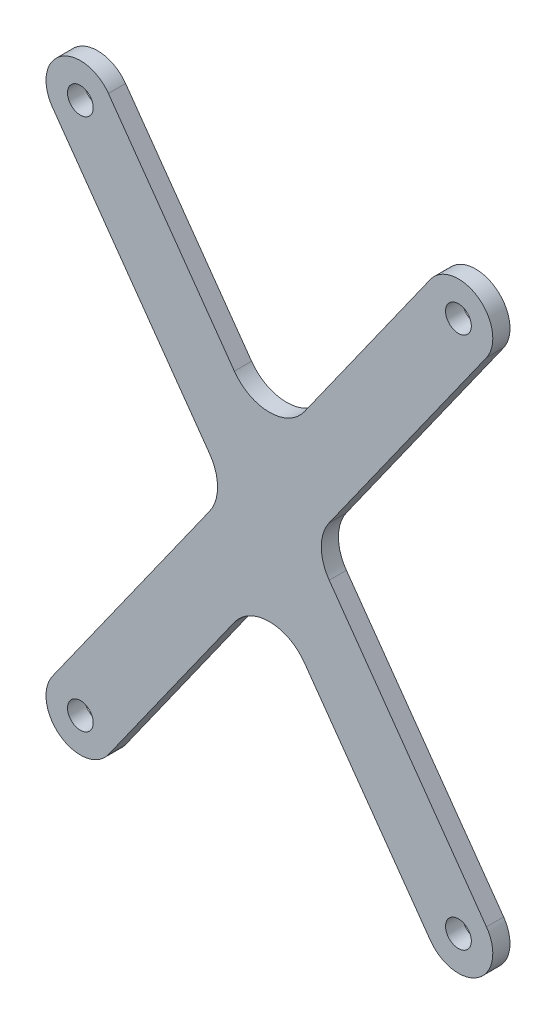
ISO-10303-21;
HEADER;
FILE_DESCRIPTION(('STEP AP214'),'2;1');
FILE_NAME('part.step','',(''),(''),'','','');
FILE_SCHEMA(('AUTOMOTIVE_DESIGN { 1 0 10303 214 1 1 1 1 }'));
ENDSEC;
DATA;
#1=APPLICATION_CONTEXT('core data for automotive mechanical design processes');
#2=APPLICATION_PROTOCOL_DEFINITION('international standard','automotive_design',2000,#1);
#3=PRODUCT_CONTEXT('',#1,'mechanical');
#4=PRODUCT('Part','Part','',(#3));
#5=PRODUCT_RELATED_PRODUCT_CATEGORY('part','',(#4));
#6=PRODUCT_DEFINITION_FORMATION('','',#4);
#7=PRODUCT_DEFINITION_CONTEXT('part definition',#1,'design');
#8=PRODUCT_DEFINITION('design','',#6,#7);
#9=PRODUCT_DEFINITION_SHAPE('','',#8);
#10=(LENGTH_UNIT() NAMED_UNIT(*) SI_UNIT(.MILLI.,.METRE.));
#11=(NAMED_UNIT(*) PLANE_ANGLE_UNIT() SI_UNIT($,.RADIAN.));
#12=(NAMED_UNIT(*) SI_UNIT($,.STERADIAN.) SOLID_ANGLE_UNIT());
#13=UNCERTAINTY_MEASURE_WITH_UNIT(LENGTH_MEASURE(1.E-05),#10,'distance_accuracy_value','');
#14=(GEOMETRIC_REPRESENTATION_CONTEXT(3) GLOBAL_UNCERTAINTY_ASSIGNED_CONTEXT((#13)) GLOBAL_UNIT_ASSIGNED_CONTEXT((#10,
#11,#12)) REPRESENTATION_CONTEXT('',''));
#15=CARTESIAN_POINT('',(0.,0.,0.));
#16=DIRECTION('',(0.,0.,1.));
#17=DIRECTION('',(1.,0.,0.));
#18=AXIS2_PLACEMENT_3D('',#15,#16,#17);
#19=CARTESIAN_POINT('',(1973.78149744196,1133.49748473224,2.));
#20=DIRECTION('',(0.,0.,1.));
#21=DIRECTION('',(1.,0.,0.));
#22=AXIS2_PLACEMENT_3D('',#19,#20,#21);
#23=PLANE('',#22);
#24=CARTESIAN_POINT('',(1973.78149744196,1195.49748473224,2.));
#25=DIRECTION('',(0.,0.,-1.));
#26=DIRECTION('',(-1.,0.,0.));
#27=AXIS2_PLACEMENT_3D('',#24,#25,#26);
#28=CIRCLE('',#27,1.50000000000006);
#29=CARTESIAN_POINT('',(1972.28149744196,1195.49748473224,2.));
#30=VERTEX_POINT('',#29);
#31=EDGE_CURVE('E222',#30,#30,#28,.T.);
#32=ORIENTED_EDGE('',*,*,#31,.T.);
#33=EDGE_LOOP('',(#32));
#34=FACE_BOUND('',#33,.T.);
#35=CARTESIAN_POINT('',(2017.78149744196,1133.49748473224,2.));
#36=DIRECTION('',(0.,0.,-1.));
#37=DIRECTION('',(-1.,0.,0.));
#38=AXIS2_PLACEMENT_3D('',#35,#36,#37);
#39=CIRCLE('',#38,1.50000000000006);
#40=CARTESIAN_POINT('',(2016.28149744196,1133.49748473224,2.));
#41=VERTEX_POINT('',#40);
#42=EDGE_CURVE('E228',#41,#41,#39,.T.);
#43=ORIENTED_EDGE('',*,*,#42,.T.);
#44=EDGE_LOOP('',(#43));
#45=FACE_BOUND('',#44,.T.);
#46=CARTESIAN_POINT('',(1984.74542000462,1164.49748473224,2.));
#47=DIRECTION('',(0.,0.,-1.));
#48=DIRECTION('',(-1.,0.,0.));
#49=AXIS2_PLACEMENT_3D('',#46,#47,#48);
#50=CIRCLE('',#49,5.00000000000012);
#51=CARTESIAN_POINT('',(1988.8229557283,1167.39121976194,2.));
#52=VERTEX_POINT('',#51);
#53=CARTESIAN_POINT('',(1988.8229557283,1161.60374970253,2.));
#54=VERTEX_POINT('',#53);
#55=EDGE_CURVE('E236',#52,#54,#50,.T.);
#56=ORIENTED_EDGE('',*,*,#55,.T.);
#57=DIRECTION('',(0.578747005941122,0.815507144735217,0.));
#58=VECTOR('',#57,1.);
#59=CARTESIAN_POINT('',(1970.51946886302,1135.812472756,2.));
#60=LINE('',#59,#58);
#61=CARTESIAN_POINT('',(1970.51946886302,1135.812472756,2.));
#62=VERTEX_POINT('',#61);
#63=EDGE_CURVE('E159',#54,#62,#60,.F.);
#64=ORIENTED_EDGE('',*,*,#63,.T.);
#65=CARTESIAN_POINT('',(1973.78149744196,1133.49748473224,2.));
#66=DIRECTION('',(0.,0.,-1.));
#67=DIRECTION('',(-1.,0.,0.));
#68=AXIS2_PLACEMENT_3D('',#65,#66,#67);
#69=CIRCLE('',#68,4.);
#70=CARTESIAN_POINT('',(1977.0435260209,1131.18249670847,2.));
#71=VERTEX_POINT('',#70);
#72=EDGE_CURVE('E162',#71,#62,#69,.T.);
#73=ORIENTED_EDGE('',*,*,#72,.F.);
#74=DIRECTION('',(-0.578747005941122,-0.815507144735217,0.));
#75=VECTOR('',#74,1.);
#76=CARTESIAN_POINT('',(1991.70396171829,1151.84038337297,2.));
#77=LINE('',#76,#75);
#78=CARTESIAN_POINT('',(1991.70396171829,1151.84038337297,2.));
#79=VERTEX_POINT('',#78);
#80=EDGE_CURVE('E134',#71,#79,#77,.F.);
#81=ORIENTED_EDGE('',*,*,#80,.T.);
#82=CARTESIAN_POINT('',(1995.78149744196,1148.94664834326,2.));
#83=DIRECTION('',(0.,0.,-1.));
#84=DIRECTION('',(-1.,0.,0.));
#85=AXIS2_PLACEMENT_3D('',#82,#83,#84);
#86=CIRCLE('',#85,5.00000000000012);
#87=CARTESIAN_POINT('',(1999.85903316564,1151.84038337297,2.));
#88=VERTEX_POINT('',#87);
#89=EDGE_CURVE('E20',#79,#88,#86,.T.);
#90=ORIENTED_EDGE('',*,*,#89,.T.);
#91=DIRECTION('',(-0.578747005941094,0.815507144735237,0.));
#92=VECTOR('',#91,1.);
#93=CARTESIAN_POINT('',(1999.85903316564,1151.84038337297,2.));
#94=LINE('',#93,#92);
#95=CARTESIAN_POINT('',(2014.51946886302,1131.18249670847,2.));
#96=VERTEX_POINT('',#95);
#97=EDGE_CURVE('E130',#88,#96,#94,.F.);
#98=ORIENTED_EDGE('',*,*,#97,.T.);
#99=CARTESIAN_POINT('',(2017.78149744196,1133.49748473224,2.));
#100=DIRECTION('',(0.,0.,-1.));
#101=DIRECTION('',(-1.,0.,0.));
#102=AXIS2_PLACEMENT_3D('',#99,#100,#101);
#103=CIRCLE('',#102,4.00000000000089);
#104=CARTESIAN_POINT('',(2021.0435260209,1135.812472756,2.));
#105=VERTEX_POINT('',#104);
#106=EDGE_CURVE('E145',#105,#96,#103,.T.);
#107=ORIENTED_EDGE('',*,*,#106,.F.);
#108=DIRECTION('',(0.57874700594113,-0.815507144735212,0.));
#109=VECTOR('',#108,1.);
#110=CARTESIAN_POINT('',(2021.0435260209,1135.812472756,2.));
#111=LINE('',#110,#109);
#112=CARTESIAN_POINT('',(2002.74003915562,1161.60374970253,2.));
#113=VERTEX_POINT('',#112);
#114=EDGE_CURVE('E182',#105,#113,#111,.F.);
#115=ORIENTED_EDGE('',*,*,#114,.T.);
#116=CARTESIAN_POINT('',(2006.8175748793,1164.49748473224,2.));
#117=DIRECTION('',(0.,0.,-1.));
#118=DIRECTION('',(-1.,0.,0.));
#119=AXIS2_PLACEMENT_3D('',#116,#117,#118);
#120=CIRCLE('',#119,5.00000000000034);
#121=CARTESIAN_POINT('',(2002.74003915562,1167.39121976194,2.));
#122=VERTEX_POINT('',#121);
#123=EDGE_CURVE('E244',#113,#122,#120,.T.);
#124=ORIENTED_EDGE('',*,*,#123,.T.);
#125=DIRECTION('',(-0.578747005941127,-0.815507144735214,0.));
#126=VECTOR('',#125,1.);
#127=CARTESIAN_POINT('',(2021.0435260209,1193.18249670847,2.));
#128=LINE('',#127,#126);
#129=CARTESIAN_POINT('',(2021.0435260209,1193.18249670847,2.));
#130=VERTEX_POINT('',#129);
#131=EDGE_CURVE('E177',#122,#130,#128,.F.);
#132=ORIENTED_EDGE('',*,*,#131,.T.);
#133=CARTESIAN_POINT('',(2017.78149744196,1195.49748473224,2.));
#134=DIRECTION('',(0.,0.,-1.));
#135=DIRECTION('',(-1.,0.,0.));
#136=AXIS2_PLACEMENT_3D('',#133,#134,#135);
#137=CIRCLE('',#136,4.);
#138=CARTESIAN_POINT('',(2014.51946886302,1197.812472756,2.));
#139=VERTEX_POINT('',#138);
#140=EDGE_CURVE('E180',#139,#130,#137,.T.);
#141=ORIENTED_EDGE('',*,*,#140,.F.);
#142=DIRECTION('',(0.578747005941113,0.815507144735224,0.));
#143=VECTOR('',#142,1.);
#144=CARTESIAN_POINT('',(1999.85903316564,1177.15458609151,2.));
#145=LINE('',#144,#143);
#146=CARTESIAN_POINT('',(1999.85903316564,1177.15458609151,2.));
#147=VERTEX_POINT('',#146);
#148=EDGE_CURVE('E173',#139,#147,#145,.F.);
#149=ORIENTED_EDGE('',*,*,#148,.T.);
#150=CARTESIAN_POINT('',(1995.78149744196,1180.04832112121,2.));
#151=DIRECTION('',(0.,0.,-1.));
#152=DIRECTION('',(-1.,0.,0.));
#153=AXIS2_PLACEMENT_3D('',#150,#151,#152);
#154=CIRCLE('',#153,5.00000000000012);
#155=CARTESIAN_POINT('',(1991.70396171829,1177.15458609151,2.));
#156=VERTEX_POINT('',#155);
#157=EDGE_CURVE('E240',#147,#156,#154,.T.);
#158=ORIENTED_EDGE('',*,*,#157,.T.);
#159=DIRECTION('',(0.578747005941113,-0.815507144735224,0.));
#160=VECTOR('',#159,1.);
#161=CARTESIAN_POINT('',(1991.70396171829,1177.15458609151,2.));
#162=LINE('',#161,#160);
#163=CARTESIAN_POINT('',(1977.0435260209,1197.812472756,2.));
#164=VERTEX_POINT('',#163);
#165=EDGE_CURVE('E168',#156,#164,#162,.F.);
#166=ORIENTED_EDGE('',*,*,#165,.T.);
#167=CARTESIAN_POINT('',(1973.78149744196,1195.49748473224,2.));
#168=DIRECTION('',(0.,0.,-1.));
#169=DIRECTION('',(-1.,0.,0.));
#170=AXIS2_PLACEMENT_3D('',#167,#168,#169);
#171=CIRCLE('',#170,3.99999999999978);
#172=CARTESIAN_POINT('',(1970.51946886302,1193.18249670847,2.));
#173=VERTEX_POINT('',#172);
#174=EDGE_CURVE('E238',#173,#164,#171,.T.);
#175=ORIENTED_EDGE('',*,*,#174,.F.);
#176=DIRECTION('',(-0.578747005941103,0.815507144735231,0.));
#177=VECTOR('',#176,1.);
#178=CARTESIAN_POINT('',(1970.51946886302,1193.18249670847,2.));
#179=LINE('',#178,#177);
#180=EDGE_CURVE('E164',#173,#52,#179,.F.);
#181=ORIENTED_EDGE('',*,*,#180,.T.);
#182=EDGE_LOOP('',(#56,#64,#73,#81,#90,#98,#107,#115,#124,#132,#141,#149,#158,#166,#175,#181));
#183=FACE_BOUND('',#182,.T.);
#184=CARTESIAN_POINT('',(1973.78149744196,1133.49748473224,2.));
#185=DIRECTION('',(0.,0.,-1.));
#186=DIRECTION('',(-1.,0.,0.));
#187=AXIS2_PLACEMENT_3D('',#184,#185,#186);
#188=CIRCLE('',#187,1.50000000000006);
#189=CARTESIAN_POINT('',(1972.28149744196,1133.49748473224,2.));
#190=VERTEX_POINT('',#189);
#191=EDGE_CURVE('E231',#190,#190,#188,.T.);
#192=ORIENTED_EDGE('',*,*,#191,.T.);
#193=EDGE_LOOP('',(#192));
#194=FACE_BOUND('',#193,.T.);
#195=CARTESIAN_POINT('',(2017.78149744196,1195.49748473224,2.));
#196=DIRECTION('',(0.,0.,-1.));
#197=DIRECTION('',(-1.,0.,0.));
#198=AXIS2_PLACEMENT_3D('',#195,#196,#197);
#199=CIRCLE('',#198,1.50000000000006);
#200=CARTESIAN_POINT('',(2016.28149744196,1195.49748473224,2.));
#201=VERTEX_POINT('',#200);
#202=EDGE_CURVE('E225',#201,#201,#199,.T.);
#203=ORIENTED_EDGE('',*,*,#202,.T.);
#204=EDGE_LOOP('',(#203));
#205=FACE_BOUND('',#204,.T.);
#206=ADVANCED_FACE('F17',(#34,#45,#183,#194,#205),#23,.T.);
#207=CARTESIAN_POINT('',(1991.70396171829,1151.84038337297,2.));
#208=DIRECTION('',(-0.815507144735217,0.578747005941122,0.));
#209=DIRECTION('',(-0.578747005941122,-0.815507144735217,0.));
#210=AXIS2_PLACEMENT_3D('',#207,#208,#209);
#211=PLANE('',#210);
#212=DIRECTION('',(0.,0.,-1.));
#213=VECTOR('',#212,1.);
#214=CARTESIAN_POINT('',(1991.70396171829,1151.84038337297,2.));
#215=LINE('',#214,#213);
#216=CARTESIAN_POINT('',(1991.70396171829,1151.84038337297,0.));
#217=VERTEX_POINT('',#216);
#218=EDGE_CURVE('E139',#217,#79,#215,.F.);
#219=ORIENTED_EDGE('',*,*,#218,.T.);
#220=ORIENTED_EDGE('',*,*,#80,.F.);
#221=DIRECTION('',(0.,0.,1.));
#222=VECTOR('',#221,1.);
#223=CARTESIAN_POINT('',(1977.0435260209,1131.18249670847,2.));
#224=LINE('',#223,#222);
#225=CARTESIAN_POINT('',(1977.0435260209,1131.18249670847,0.));
#226=VERTEX_POINT('',#225);
#227=EDGE_CURVE('E156',#226,#71,#224,.T.);
#228=ORIENTED_EDGE('',*,*,#227,.F.);
#229=DIRECTION('',(0.578747005941122,0.815507144735217,0.));
#230=VECTOR('',#229,1.);
#231=CARTESIAN_POINT('',(1977.0435260209,1131.18249670847,0.));
#232=LINE('',#231,#230);
#233=EDGE_CURVE('E220',#226,#217,#232,.T.);
#234=ORIENTED_EDGE('',*,*,#233,.T.);
#235=EDGE_LOOP('',(#219,#220,#228,#234));
#236=FACE_BOUND('',#235,.T.);
#237=ADVANCED_FACE('F499',(#236),#211,.F.);
#238=CARTESIAN_POINT('',(1995.78149744196,1148.94664834326,2.));
#239=DIRECTION('',(0.,0.,-1.));
#240=DIRECTION('',(-1.,0.,0.));
#241=AXIS2_PLACEMENT_3D('',#238,#239,#240);
#242=CYLINDRICAL_SURFACE('',#241,5.00000000000012);
#243=DIRECTION('',(0.,0.,1.));
#244=VECTOR('',#243,1.);
#245=CARTESIAN_POINT('',(1999.85903316564,1151.84038337297,2.));
#246=LINE('',#245,#244);
#247=CARTESIAN_POINT('',(1999.85903316564,1151.84038337297,0.));
#248=VERTEX_POINT('',#247);
#249=EDGE_CURVE('E138',#248,#88,#246,.T.);
#250=ORIENTED_EDGE('',*,*,#249,.T.);
#251=ORIENTED_EDGE('',*,*,#89,.F.);
#252=ORIENTED_EDGE('',*,*,#218,.F.);
#253=CARTESIAN_POINT('',(1995.78149744196,1148.94664834326,0.));
#254=DIRECTION('',(0.,0.,-1.));
#255=DIRECTION('',(-1.,0.,0.));
#256=AXIS2_PLACEMENT_3D('',#253,#254,#255);
#257=CIRCLE('',#256,5.00000000000012);
#258=EDGE_CURVE('E150',#217,#248,#257,.T.);
#259=ORIENTED_EDGE('',*,*,#258,.T.);
#260=EDGE_LOOP('',(#250,#251,#252,#259));
#261=FACE_BOUND('',#260,.T.);
#262=ADVANCED_FACE('F148',(#261),#242,.F.);
#263=CARTESIAN_POINT('',(1999.85903316564,1151.84038337297,2.));
#264=DIRECTION('',(0.815507144735237,0.578747005941094,0.));
#265=DIRECTION('',(-0.578747005941094,0.815507144735237,0.));
#266=AXIS2_PLACEMENT_3D('',#263,#264,#265);
#267=PLANE('',#266);
#268=DIRECTION('',(0.,0.,-1.));
#269=VECTOR('',#268,1.);
#270=CARTESIAN_POINT('',(2014.51946886302,1131.18249670847,2.));
#271=LINE('',#270,#269);
#272=CARTESIAN_POINT('',(2014.51946886302,1131.18249670847,0.));
#273=VERTEX_POINT('',#272);
#274=EDGE_CURVE('E144',#96,#273,#271,.T.);
#275=ORIENTED_EDGE('',*,*,#274,.F.);
#276=ORIENTED_EDGE('',*,*,#97,.F.);
#277=ORIENTED_EDGE('',*,*,#249,.F.);
#278=DIRECTION('',(0.578747005941126,-0.815507144735215,0.));
#279=VECTOR('',#278,1.);
#280=CARTESIAN_POINT('',(1999.85903316564,1151.84038337297,0.));
#281=LINE('',#280,#279);
#282=EDGE_CURVE('E218',#248,#273,#281,.T.);
#283=ORIENTED_EDGE('',*,*,#282,.T.);
#284=EDGE_LOOP('',(#275,#276,#277,#283));
#285=FACE_BOUND('',#284,.T.);
#286=ADVANCED_FACE('F141',(#285),#267,.F.);
#287=CARTESIAN_POINT('',(2017.78149744196,1133.49748473224,2.));
#288=DIRECTION('',(0.,0.,-1.));
#289=DIRECTION('',(-1.,0.,0.));
#290=AXIS2_PLACEMENT_3D('',#287,#288,#289);
#291=CYLINDRICAL_SURFACE('',#290,4.00000000000089);
#292=ORIENTED_EDGE('',*,*,#106,.T.);
#293=ORIENTED_EDGE('',*,*,#274,.T.);
#294=CARTESIAN_POINT('',(2017.78149744196,1133.49748473224,0.));
#295=DIRECTION('',(0.,0.,-1.));
#296=DIRECTION('',(-1.,0.,0.));
#297=AXIS2_PLACEMENT_3D('',#294,#295,#296);
#298=CIRCLE('',#297,4.00000000000089);
#299=CARTESIAN_POINT('',(2021.0435260209,1135.812472756,0.));
#300=VERTEX_POINT('',#299);
#301=EDGE_CURVE('E215',#273,#300,#298,.F.);
#302=ORIENTED_EDGE('',*,*,#301,.T.);
#303=DIRECTION('',(0.,0.,1.));
#304=VECTOR('',#303,1.);
#305=CARTESIAN_POINT('',(2021.0435260209,1135.812472756,2.));
#306=LINE('',#305,#304);
#307=EDGE_CURVE('E185',#300,#105,#306,.T.);
#308=ORIENTED_EDGE('',*,*,#307,.T.);
#309=EDGE_LOOP('',(#292,#293,#302,#308));
#310=FACE_BOUND('',#309,.T.);
#311=ADVANCED_FACE('F477',(#310),#291,.T.);
#312=CARTESIAN_POINT('',(2021.0435260209,1135.812472756,2.));
#313=DIRECTION('',(-0.815507144735212,-0.57874700594113,0.));
#314=DIRECTION('',(0.57874700594113,-0.815507144735212,0.));
#315=AXIS2_PLACEMENT_3D('',#312,#313,#314);
#316=PLANE('',#315);
#317=DIRECTION('',(0.,0.,-1.));
#318=VECTOR('',#317,1.);
#319=CARTESIAN_POINT('',(2002.74003915562,1161.60374970253,2.));
#320=LINE('',#319,#318);
#321=CARTESIAN_POINT('',(2002.74003915562,1161.60374970253,0.));
#322=VERTEX_POINT('',#321);
#323=EDGE_CURVE('E184',#322,#113,#320,.F.);
#324=ORIENTED_EDGE('',*,*,#323,.T.);
#325=ORIENTED_EDGE('',*,*,#114,.F.);
#326=ORIENTED_EDGE('',*,*,#307,.F.);
#327=DIRECTION('',(-0.57874700594113,0.815507144735212,0.));
#328=VECTOR('',#327,1.);
#329=CARTESIAN_POINT('',(2021.0435260209,1135.812472756,0.));
#330=LINE('',#329,#328);
#331=EDGE_CURVE('E214',#300,#322,#330,.T.);
#332=ORIENTED_EDGE('',*,*,#331,.T.);
#333=EDGE_LOOP('',(#324,#325,#326,#332));
#334=FACE_BOUND('',#333,.T.);
#335=ADVANCED_FACE('F325',(#334),#316,.F.);
#336=CARTESIAN_POINT('',(2006.8175748793,1164.49748473224,2.));
#337=DIRECTION('',(0.,0.,-1.));
#338=DIRECTION('',(-1.,0.,0.));
#339=AXIS2_PLACEMENT_3D('',#336,#337,#338);
#340=CYLINDRICAL_SURFACE('',#339,5.00000000000034);
#341=ORIENTED_EDGE('',*,*,#123,.F.);
#342=ORIENTED_EDGE('',*,*,#323,.F.);
#343=CARTESIAN_POINT('',(2006.8175748793,1164.49748473224,0.));
#344=DIRECTION('',(0.,0.,-1.));
#345=DIRECTION('',(-1.,0.,0.));
#346=AXIS2_PLACEMENT_3D('',#343,#344,#345);
#347=CIRCLE('',#346,5.00000000000034);
#348=CARTESIAN_POINT('',(2002.74003915562,1167.39121976194,0.));
#349=VERTEX_POINT('',#348);
#350=EDGE_CURVE('E212',#322,#349,#347,.T.);
#351=ORIENTED_EDGE('',*,*,#350,.T.);
#352=DIRECTION('',(0.,0.,1.));
#353=VECTOR('',#352,1.);
#354=CARTESIAN_POINT('',(2002.74003915562,1167.39121976194,2.));
#355=LINE('',#354,#353);
#356=EDGE_CURVE('E181',#349,#122,#355,.T.);
#357=ORIENTED_EDGE('',*,*,#356,.T.);
#358=EDGE_LOOP('',(#341,#342,#351,#357));
#359=FACE_BOUND('',#358,.T.);
#360=ADVANCED_FACE('F322',(#359),#340,.F.);
#361=CARTESIAN_POINT('',(2021.0435260209,1193.18249670847,2.));
#362=DIRECTION('',(-0.815507144735214,0.578747005941127,0.));
#363=DIRECTION('',(-0.578747005941127,-0.815507144735214,0.));
#364=AXIS2_PLACEMENT_3D('',#361,#362,#363);
#365=PLANE('',#364);
#366=DIRECTION('',(0.,0.,-1.));
#367=VECTOR('',#366,1.);
#368=CARTESIAN_POINT('',(2021.0435260209,1193.18249670847,2.));
#369=LINE('',#368,#367);
#370=CARTESIAN_POINT('',(2021.0435260209,1193.18249670847,0.));
#371=VERTEX_POINT('',#370);
#372=EDGE_CURVE('E243',#130,#371,#369,.T.);
#373=ORIENTED_EDGE('',*,*,#372,.F.);
#374=ORIENTED_EDGE('',*,*,#131,.F.);
#375=ORIENTED_EDGE('',*,*,#356,.F.);
#376=DIRECTION('',(0.578747005941127,0.815507144735214,0.));
#377=VECTOR('',#376,1.);
#378=CARTESIAN_POINT('',(2002.74003915562,1167.39121976194,0.));
#379=LINE('',#378,#377);
#380=EDGE_CURVE('E211',#349,#371,#379,.T.);
#381=ORIENTED_EDGE('',*,*,#380,.T.);
#382=EDGE_LOOP('',(#373,#374,#375,#381));
#383=FACE_BOUND('',#382,.T.);
#384=ADVANCED_FACE('F319',(#383),#365,.F.);
#385=CARTESIAN_POINT('',(2017.78149744196,1195.49748473224,2.));
#386=DIRECTION('',(0.,0.,-1.));
#387=DIRECTION('',(-1.,0.,0.));
#388=AXIS2_PLACEMENT_3D('',#385,#386,#387);
#389=CYLINDRICAL_SURFACE('',#388,4.);
#390=ORIENTED_EDGE('',*,*,#140,.T.);
#391=ORIENTED_EDGE('',*,*,#372,.T.);
#392=CARTESIAN_POINT('',(2017.78149744196,1195.49748473224,0.));
#393=DIRECTION('',(0.,0.,-1.));
#394=DIRECTION('',(-1.,0.,0.));
#395=AXIS2_PLACEMENT_3D('',#392,#393,#394);
#396=CIRCLE('',#395,4.);
#397=CARTESIAN_POINT('',(2014.51946886302,1197.812472756,0.));
#398=VERTEX_POINT('',#397);
#399=EDGE_CURVE('E208',#371,#398,#396,.F.);
#400=ORIENTED_EDGE('',*,*,#399,.T.);
#401=DIRECTION('',(0.,0.,1.));
#402=VECTOR('',#401,1.);
#403=CARTESIAN_POINT('',(2014.51946886302,1197.812472756,2.));
#404=LINE('',#403,#402);
#405=EDGE_CURVE('E176',#398,#139,#404,.T.);
#406=ORIENTED_EDGE('',*,*,#405,.T.);
#407=EDGE_LOOP('',(#390,#391,#400,#406));
#408=FACE_BOUND('',#407,.T.);
#409=ADVANCED_FACE('F313',(#408),#389,.T.);
#410=CARTESIAN_POINT('',(1999.85903316564,1177.15458609151,2.));
#411=DIRECTION('',(0.815507144735224,-0.578747005941113,0.));
#412=DIRECTION('',(0.578747005941113,0.815507144735224,0.));
#413=AXIS2_PLACEMENT_3D('',#410,#411,#412);
#414=PLANE('',#413);
#415=DIRECTION('',(0.,0.,-1.));
#416=VECTOR('',#415,1.);
#417=CARTESIAN_POINT('',(1999.85903316564,1177.15458609151,2.));
#418=LINE('',#417,#416);
#419=CARTESIAN_POINT('',(1999.85903316564,1177.15458609151,0.));
#420=VERTEX_POINT('',#419);
#421=EDGE_CURVE('E175',#420,#147,#418,.F.);
#422=ORIENTED_EDGE('',*,*,#421,.T.);
#423=ORIENTED_EDGE('',*,*,#148,.F.);
#424=ORIENTED_EDGE('',*,*,#405,.F.);
#425=DIRECTION('',(-0.578747005941109,-0.815507144735227,0.));
#426=VECTOR('',#425,1.);
#427=CARTESIAN_POINT('',(2014.51946886302,1197.812472756,0.));
#428=LINE('',#427,#426);
#429=EDGE_CURVE('E207',#398,#420,#428,.T.);
#430=ORIENTED_EDGE('',*,*,#429,.T.);
#431=EDGE_LOOP('',(#422,#423,#424,#430));
#432=FACE_BOUND('',#431,.T.);
#433=ADVANCED_FACE('F310',(#432),#414,.F.);
#434=CARTESIAN_POINT('',(1995.78149744196,1180.04832112121,2.));
#435=DIRECTION('',(0.,0.,-1.));
#436=DIRECTION('',(-1.,0.,0.));
#437=AXIS2_PLACEMENT_3D('',#434,#435,#436);
#438=CYLINDRICAL_SURFACE('',#437,5.00000000000012);
#439=DIRECTION('',(0.,0.,1.));
#440=VECTOR('',#439,1.);
#441=CARTESIAN_POINT('',(1991.70396171829,1177.15458609151,2.));
#442=LINE('',#441,#440);
#443=CARTESIAN_POINT('',(1991.70396171829,1177.15458609151,0.));
#444=VERTEX_POINT('',#443);
#445=EDGE_CURVE('E172',#444,#156,#442,.T.);
#446=ORIENTED_EDGE('',*,*,#445,.T.);
#447=ORIENTED_EDGE('',*,*,#157,.F.);
#448=ORIENTED_EDGE('',*,*,#421,.F.);
#449=CARTESIAN_POINT('',(1995.78149744196,1180.04832112121,0.));
#450=DIRECTION('',(0.,0.,-1.));
#451=DIRECTION('',(-1.,0.,0.));
#452=AXIS2_PLACEMENT_3D('',#449,#450,#451);
#453=CIRCLE('',#452,5.00000000000012);
#454=EDGE_CURVE('E204',#420,#444,#453,.T.);
#455=ORIENTED_EDGE('',*,*,#454,.T.);
#456=EDGE_LOOP('',(#446,#447,#448,#455));
#457=FACE_BOUND('',#456,.T.);
#458=ADVANCED_FACE('F306',(#457),#438,.F.);
#459=CARTESIAN_POINT('',(1991.70396171829,1177.15458609151,2.));
#460=DIRECTION('',(-0.815507144735224,-0.578747005941113,0.));
#461=DIRECTION('',(0.578747005941113,-0.815507144735224,0.));
#462=AXIS2_PLACEMENT_3D('',#459,#460,#461);
#463=PLANE('',#462);
#464=DIRECTION('',(0.,0.,-1.));
#465=VECTOR('',#464,1.);
#466=CARTESIAN_POINT('',(1977.0435260209,1197.812472756,2.));
#467=LINE('',#466,#465);
#468=CARTESIAN_POINT('',(1977.0435260209,1197.812472756,0.));
#469=VERTEX_POINT('',#468);
#470=EDGE_CURVE('E171',#164,#469,#467,.T.);
#471=ORIENTED_EDGE('',*,*,#470,.F.);
#472=ORIENTED_EDGE('',*,*,#165,.F.);
#473=ORIENTED_EDGE('',*,*,#445,.F.);
#474=DIRECTION('',(-0.578747005941115,0.815507144735222,0.));
#475=VECTOR('',#474,1.);
#476=CARTESIAN_POINT('',(1991.70396171829,1177.15458609151,0.));
#477=LINE('',#476,#475);
#478=EDGE_CURVE('E203',#444,#469,#477,.T.);
#479=ORIENTED_EDGE('',*,*,#478,.T.);
#480=EDGE_LOOP('',(#471,#472,#473,#479));
#481=FACE_BOUND('',#480,.T.);
#482=ADVANCED_FACE('F302',(#481),#463,.F.);
#483=CARTESIAN_POINT('',(1973.78149744196,1195.49748473224,2.));
#484=DIRECTION('',(0.,0.,-1.));
#485=DIRECTION('',(-1.,0.,0.));
#486=AXIS2_PLACEMENT_3D('',#483,#484,#485);
#487=CYLINDRICAL_SURFACE('',#486,3.99999999999978);
#488=CARTESIAN_POINT('',(1973.78149744196,1195.49748473224,0.));
#489=DIRECTION('',(0.,0.,-1.));
#490=DIRECTION('',(-1.,0.,0.));
#491=AXIS2_PLACEMENT_3D('',#488,#489,#490);
#492=CIRCLE('',#491,3.99999999999978);
#493=CARTESIAN_POINT('',(1970.51946886302,1193.18249670847,0.));
#494=VERTEX_POINT('',#493);
#495=EDGE_CURVE('E201',#469,#494,#492,.F.);
#496=ORIENTED_EDGE('',*,*,#495,.T.);
#497=DIRECTION('',(0.,0.,1.));
#498=VECTOR('',#497,1.);
#499=CARTESIAN_POINT('',(1970.51946886302,1193.18249670847,2.));
#500=LINE('',#499,#498);
#501=EDGE_CURVE('E167',#494,#173,#500,.T.);
#502=ORIENTED_EDGE('',*,*,#501,.T.);
#503=ORIENTED_EDGE('',*,*,#174,.T.);
#504=ORIENTED_EDGE('',*,*,#470,.T.);
#505=EDGE_LOOP('',(#496,#502,#503,#504));
#506=FACE_BOUND('',#505,.T.);
#507=ADVANCED_FACE('F327',(#506),#487,.T.);
#508=CARTESIAN_POINT('',(1970.51946886302,1193.18249670847,2.));
#509=DIRECTION('',(0.815507144735231,0.578747005941103,0.));
#510=DIRECTION('',(-0.578747005941103,0.815507144735231,0.));
#511=AXIS2_PLACEMENT_3D('',#508,#509,#510);
#512=PLANE('',#511);
#513=DIRECTION('',(0.,0.,-1.));
#514=VECTOR('',#513,1.);
#515=CARTESIAN_POINT('',(1988.8229557283,1167.39121976194,2.));
#516=LINE('',#515,#514);
#517=CARTESIAN_POINT('',(1988.8229557283,1167.39121976194,0.));
#518=VERTEX_POINT('',#517);
#519=EDGE_CURVE('E166',#518,#52,#516,.F.);
#520=ORIENTED_EDGE('',*,*,#519,.T.);
#521=ORIENTED_EDGE('',*,*,#180,.F.);
#522=ORIENTED_EDGE('',*,*,#501,.F.);
#523=DIRECTION('',(0.578747005941098,-0.815507144735235,0.));
#524=VECTOR('',#523,1.);
#525=CARTESIAN_POINT('',(1970.51946886302,1193.18249670847,0.));
#526=LINE('',#525,#524);
#527=EDGE_CURVE('E200',#494,#518,#526,.T.);
#528=ORIENTED_EDGE('',*,*,#527,.T.);
#529=EDGE_LOOP('',(#520,#521,#522,#528));
#530=FACE_BOUND('',#529,.T.);
#531=ADVANCED_FACE('F294',(#530),#512,.F.);
#532=CARTESIAN_POINT('',(1984.74542000462,1164.49748473224,2.));
#533=DIRECTION('',(0.,0.,-1.));
#534=DIRECTION('',(-1.,0.,0.));
#535=AXIS2_PLACEMENT_3D('',#532,#533,#534);
#536=CYLINDRICAL_SURFACE('',#535,5.00000000000012);
#537=DIRECTION('',(0.,0.,1.));
#538=VECTOR('',#537,1.);
#539=CARTESIAN_POINT('',(1988.8229557283,1161.60374970253,2.));
#540=LINE('',#539,#538);
#541=CARTESIAN_POINT('',(1988.8229557283,1161.60374970253,0.));
#542=VERTEX_POINT('',#541);
#543=EDGE_CURVE('E163',#542,#54,#540,.T.);
#544=ORIENTED_EDGE('',*,*,#543,.T.);
#545=ORIENTED_EDGE('',*,*,#55,.F.);
#546=ORIENTED_EDGE('',*,*,#519,.F.);
#547=CARTESIAN_POINT('',(1984.74542000462,1164.49748473224,0.));
#548=DIRECTION('',(0.,0.,-1.));
#549=DIRECTION('',(-1.,0.,0.));
#550=AXIS2_PLACEMENT_3D('',#547,#548,#549);
#551=CIRCLE('',#550,5.00000000000012);
#552=EDGE_CURVE('E197',#518,#542,#551,.T.);
#553=ORIENTED_EDGE('',*,*,#552,.T.);
#554=EDGE_LOOP('',(#544,#545,#546,#553));
#555=FACE_BOUND('',#554,.T.);
#556=ADVANCED_FACE('F290',(#555),#536,.F.);
#557=CARTESIAN_POINT('',(1970.51946886302,1135.812472756,2.));
#558=DIRECTION('',(0.815507144735217,-0.578747005941122,0.));
#559=DIRECTION('',(0.578747005941122,0.815507144735217,0.));
#560=AXIS2_PLACEMENT_3D('',#557,#558,#559);
#561=PLANE('',#560);
#562=DIRECTION('',(0.,0.,-1.));
#563=VECTOR('',#562,1.);
#564=CARTESIAN_POINT('',(1970.51946886302,1135.812472756,2.));
#565=LINE('',#564,#563);
#566=CARTESIAN_POINT('',(1970.51946886302,1135.812472756,0.));
#567=VERTEX_POINT('',#566);
#568=EDGE_CURVE('E234',#62,#567,#565,.T.);
#569=ORIENTED_EDGE('',*,*,#568,.F.);
#570=ORIENTED_EDGE('',*,*,#63,.F.);
#571=ORIENTED_EDGE('',*,*,#543,.F.);
#572=DIRECTION('',(-0.578747005941118,-0.81550714473522,0.));
#573=VECTOR('',#572,1.);
#574=CARTESIAN_POINT('',(1988.8229557283,1161.60374970253,0.));
#575=LINE('',#574,#573);
#576=EDGE_CURVE('E196',#542,#567,#575,.T.);
#577=ORIENTED_EDGE('',*,*,#576,.T.);
#578=EDGE_LOOP('',(#569,#570,#571,#577));
#579=FACE_BOUND('',#578,.T.);
#580=ADVANCED_FACE('F284',(#579),#561,.F.);
#581=CARTESIAN_POINT('',(1973.78149744196,1133.49748473224,2.));
#582=DIRECTION('',(0.,0.,-1.));
#583=DIRECTION('',(-1.,0.,0.));
#584=AXIS2_PLACEMENT_3D('',#581,#582,#583);
#585=CYLINDRICAL_SURFACE('',#584,4.);
#586=ORIENTED_EDGE('',*,*,#568,.T.);
#587=CARTESIAN_POINT('',(1973.78149744196,1133.49748473224,0.));
#588=DIRECTION('',(0.,0.,-1.));
#589=DIRECTION('',(-1.,0.,0.));
#590=AXIS2_PLACEMENT_3D('',#587,#588,#589);
#591=CIRCLE('',#590,4.);
#592=EDGE_CURVE('E35',#567,#226,#591,.F.);
#593=ORIENTED_EDGE('',*,*,#592,.T.);
#594=ORIENTED_EDGE('',*,*,#227,.T.);
#595=ORIENTED_EDGE('',*,*,#72,.T.);
#596=EDGE_LOOP('',(#586,#593,#594,#595));
#597=FACE_BOUND('',#596,.T.);
#598=ADVANCED_FACE('F360',(#597),#585,.T.);
#599=CARTESIAN_POINT('',(1973.78149744196,1133.49748473224,2.));
#600=DIRECTION('',(0.,0.,-1.));
#601=DIRECTION('',(-1.,0.,0.));
#602=AXIS2_PLACEMENT_3D('',#599,#600,#601);
#603=CYLINDRICAL_SURFACE('',#602,1.50000000000006);
#604=CARTESIAN_POINT('',(1973.78149744196,1133.49748473224,0.));
#605=DIRECTION('',(0.,0.,-1.));
#606=DIRECTION('',(-1.,0.,0.));
#607=AXIS2_PLACEMENT_3D('',#604,#605,#606);
#608=CIRCLE('',#607,1.50000000000006);
#609=CARTESIAN_POINT('',(1972.28149744196,1133.49748473224,0.));
#610=VERTEX_POINT('',#609);
#611=EDGE_CURVE('E193',#610,#610,#608,.T.);
#612=ORIENTED_EDGE('',*,*,#611,.T.);
#613=EDGE_LOOP('',(#612));
#614=FACE_BOUND('',#613,.T.);
#615=ORIENTED_EDGE('',*,*,#191,.F.);
#616=EDGE_LOOP('',(#615));
#617=FACE_BOUND('',#616,.T.);
#618=ADVANCED_FACE('F356',(#614,#617),#603,.F.);
#619=CARTESIAN_POINT('',(2017.78149744196,1133.49748473224,2.));
#620=DIRECTION('',(0.,0.,-1.));
#621=DIRECTION('',(-1.,0.,0.));
#622=AXIS2_PLACEMENT_3D('',#619,#620,#621);
#623=CYLINDRICAL_SURFACE('',#622,1.50000000000006);
#624=CARTESIAN_POINT('',(2017.78149744196,1133.49748473224,0.));
#625=DIRECTION('',(0.,0.,-1.));
#626=DIRECTION('',(-1.,0.,0.));
#627=AXIS2_PLACEMENT_3D('',#624,#625,#626);
#628=CIRCLE('',#627,1.50000000000006);
#629=CARTESIAN_POINT('',(2016.28149744196,1133.49748473224,0.));
#630=VERTEX_POINT('',#629);
#631=EDGE_CURVE('E190',#630,#630,#628,.T.);
#632=ORIENTED_EDGE('',*,*,#631,.T.);
#633=EDGE_LOOP('',(#632));
#634=FACE_BOUND('',#633,.T.);
#635=ORIENTED_EDGE('',*,*,#42,.F.);
#636=EDGE_LOOP('',(#635));
#637=FACE_BOUND('',#636,.T.);
#638=ADVANCED_FACE('F352',(#634,#637),#623,.F.);
#639=CARTESIAN_POINT('',(2017.78149744196,1195.49748473224,2.));
#640=DIRECTION('',(0.,0.,-1.));
#641=DIRECTION('',(-1.,0.,0.));
#642=AXIS2_PLACEMENT_3D('',#639,#640,#641);
#643=CYLINDRICAL_SURFACE('',#642,1.50000000000006);
#644=CARTESIAN_POINT('',(2017.78149744196,1195.49748473224,0.));
#645=DIRECTION('',(0.,0.,-1.));
#646=DIRECTION('',(-1.,0.,0.));
#647=AXIS2_PLACEMENT_3D('',#644,#645,#646);
#648=CIRCLE('',#647,1.50000000000006);
#649=CARTESIAN_POINT('',(2016.28149744196,1195.49748473224,0.));
#650=VERTEX_POINT('',#649);
#651=EDGE_CURVE('E26',#650,#650,#648,.T.);
#652=ORIENTED_EDGE('',*,*,#651,.T.);
#653=EDGE_LOOP('',(#652));
#654=FACE_BOUND('',#653,.T.);
#655=ORIENTED_EDGE('',*,*,#202,.F.);
#656=EDGE_LOOP('',(#655));
#657=FACE_BOUND('',#656,.T.);
#658=ADVANCED_FACE('F344',(#654,#657),#643,.F.);
#659=CARTESIAN_POINT('',(1973.78149744196,1195.49748473224,2.));
#660=DIRECTION('',(0.,0.,-1.));
#661=DIRECTION('',(-1.,0.,0.));
#662=AXIS2_PLACEMENT_3D('',#659,#660,#661);
#663=CYLINDRICAL_SURFACE('',#662,1.50000000000006);
#664=CARTESIAN_POINT('',(1973.78149744196,1195.49748473224,0.));
#665=DIRECTION('',(0.,0.,-1.));
#666=DIRECTION('',(-1.,0.,0.));
#667=AXIS2_PLACEMENT_3D('',#664,#665,#666);
#668=CIRCLE('',#667,1.50000000000006);
#669=CARTESIAN_POINT('',(1972.28149744196,1195.49748473224,0.));
#670=VERTEX_POINT('',#669);
#671=EDGE_CURVE('E11',#670,#670,#668,.T.);
#672=ORIENTED_EDGE('',*,*,#671,.T.);
#673=EDGE_LOOP('',(#672));
#674=FACE_BOUND('',#673,.T.);
#675=ORIENTED_EDGE('',*,*,#31,.F.);
#676=EDGE_LOOP('',(#675));
#677=FACE_BOUND('',#676,.T.);
#678=ADVANCED_FACE('F338',(#674,#677),#663,.F.);
#679=CARTESIAN_POINT('',(1973.78149744196,1133.49748473224,0.));
#680=DIRECTION('',(0.,0.,1.));
#681=DIRECTION('',(1.,0.,0.));
#682=AXIS2_PLACEMENT_3D('',#679,#680,#681);
#683=PLANE('',#682);
#684=ORIENTED_EDGE('',*,*,#671,.F.);
#685=EDGE_LOOP('',(#684));
#686=FACE_BOUND('',#685,.T.);
#687=ORIENTED_EDGE('',*,*,#651,.F.);
#688=EDGE_LOOP('',(#687));
#689=FACE_BOUND('',#688,.T.);
#690=ORIENTED_EDGE('',*,*,#631,.F.);
#691=EDGE_LOOP('',(#690));
#692=FACE_BOUND('',#691,.T.);
#693=ORIENTED_EDGE('',*,*,#611,.F.);
#694=EDGE_LOOP('',(#693));
#695=FACE_BOUND('',#694,.T.);
#696=ORIENTED_EDGE('',*,*,#576,.F.);
#697=ORIENTED_EDGE('',*,*,#552,.F.);
#698=ORIENTED_EDGE('',*,*,#527,.F.);
#699=ORIENTED_EDGE('',*,*,#495,.F.);
#700=ORIENTED_EDGE('',*,*,#478,.F.);
#701=ORIENTED_EDGE('',*,*,#454,.F.);
#702=ORIENTED_EDGE('',*,*,#429,.F.);
#703=ORIENTED_EDGE('',*,*,#399,.F.);
#704=ORIENTED_EDGE('',*,*,#380,.F.);
#705=ORIENTED_EDGE('',*,*,#350,.F.);
#706=ORIENTED_EDGE('',*,*,#331,.F.);
#707=ORIENTED_EDGE('',*,*,#301,.F.);
#708=ORIENTED_EDGE('',*,*,#282,.F.);
#709=ORIENTED_EDGE('',*,*,#258,.F.);
#710=ORIENTED_EDGE('',*,*,#233,.F.);
#711=ORIENTED_EDGE('',*,*,#592,.F.);
#712=EDGE_LOOP('',(#696,#697,#698,#699,#700,#701,#702,#703,#704,#705,#706,#707,#708,#709,#710,#711));
#713=FACE_BOUND('',#712,.T.);
#714=ADVANCED_FACE('F287',(#686,#689,#692,#695,#713),#683,.F.);
#715=CLOSED_SHELL('',(#206,#237,#262,#286,#311,#335,#360,#384,#409,#433,#458,#482,#507,#531,
#556,#580,#598,#618,#638,#658,#678,#714));
#716=MANIFOLD_SOLID_BREP('B1',#715);
#717=ADVANCED_BREP_SHAPE_REPRESENTATION('',(#18,#716),#14);
#718=SHAPE_DEFINITION_REPRESENTATION(#9,#717);
ENDSEC;
END-ISO-10303-21;
